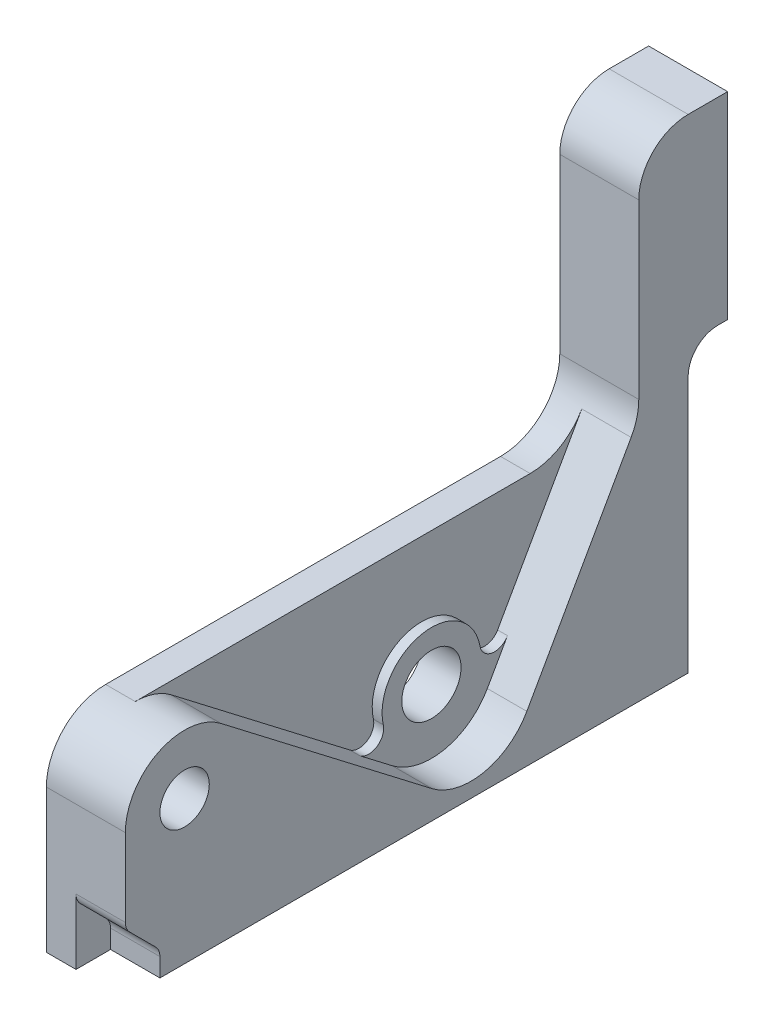
ISO-10303-21;
HEADER;
FILE_DESCRIPTION(('STEP AP214'),'2;1');
FILE_NAME('part.step','',(''),(''),'','','');
FILE_SCHEMA(('AUTOMOTIVE_DESIGN { 1 0 10303 214 1 1 1 1 }'));
ENDSEC;
DATA;
#1=APPLICATION_CONTEXT('core data for automotive mechanical design processes');
#2=APPLICATION_PROTOCOL_DEFINITION('international standard','automotive_design',2000,#1);
#3=PRODUCT_CONTEXT('',#1,'mechanical');
#4=PRODUCT('Part','Part','',(#3));
#5=PRODUCT_RELATED_PRODUCT_CATEGORY('part','',(#4));
#6=PRODUCT_DEFINITION_FORMATION('','',#4);
#7=PRODUCT_DEFINITION_CONTEXT('part definition',#1,'design');
#8=PRODUCT_DEFINITION('design','',#6,#7);
#9=PRODUCT_DEFINITION_SHAPE('','',#8);
#10=(LENGTH_UNIT() NAMED_UNIT(*) SI_UNIT(.MILLI.,.METRE.));
#11=(NAMED_UNIT(*) PLANE_ANGLE_UNIT() SI_UNIT($,.RADIAN.));
#12=(NAMED_UNIT(*) SI_UNIT($,.STERADIAN.) SOLID_ANGLE_UNIT());
#13=UNCERTAINTY_MEASURE_WITH_UNIT(LENGTH_MEASURE(1.E-05),#10,'distance_accuracy_value','');
#14=(GEOMETRIC_REPRESENTATION_CONTEXT(3) GLOBAL_UNCERTAINTY_ASSIGNED_CONTEXT((#13)) GLOBAL_UNIT_ASSIGNED_CONTEXT((#10,
#11,#12)) REPRESENTATION_CONTEXT('',''));
#15=CARTESIAN_POINT('',(0.,0.,0.));
#16=DIRECTION('',(0.,0.,1.));
#17=DIRECTION('',(1.,0.,0.));
#18=AXIS2_PLACEMENT_3D('',#15,#16,#17);
#19=CARTESIAN_POINT('',(3.,26.5,-46.));
#20=DIRECTION('',(1.,0.,0.));
#21=DIRECTION('',(0.,0.,-1.));
#22=AXIS2_PLACEMENT_3D('',#19,#20,#21);
#23=PLANE('',#22);
#24=DIRECTION('',(0.,-0.608841317764241,-0.793292033101999));
#25=VECTOR('',#24,1.);
#26=CARTESIAN_POINT('',(3.,19.259752198612,-9.65304790658545));
#27=LINE('',#26,#25);
#28=CARTESIAN_POINT('',(3.,19.259752198612,-9.65304790658544));
#29=VERTEX_POINT('',#28);
#30=CARTESIAN_POINT('',(3.,5.37230969427247,-27.7477421683185));
#31=VERTEX_POINT('',#30);
#32=EDGE_CURVE('E280',#29,#31,#27,.T.);
#33=ORIENTED_EDGE('',*,*,#32,.T.);
#34=CARTESIAN_POINT('',(3.,6.56224774392547,-28.6610041449649));
#35=DIRECTION('',(-1.,0.,0.));
#36=DIRECTION('',(0.,0.,1.));
#37=AXIS2_PLACEMENT_3D('',#34,#35,#36);
#38=CIRCLE('',#37,1.5);
#39=CARTESIAN_POINT('',(3.,6.89403672609651,-30.1238493422807));
#40=VERTEX_POINT('',#39);
#41=EDGE_CURVE('E228',#40,#31,#38,.T.);
#42=ORIENTED_EDGE('',*,*,#41,.F.);
#43=CARTESIAN_POINT('',(3.,8.,-35.));
#44=DIRECTION('',(1.,0.,0.));
#45=DIRECTION('',(0.,0.,1.));
#46=AXIS2_PLACEMENT_3D('',#43,#44,#45);
#47=CIRCLE('',#46,5.);
#48=CARTESIAN_POINT('',(3.,8.89493751867646,-39.9192567363033));
#49=VERTEX_POINT('',#48);
#50=EDGE_CURVE('E222',#49,#40,#47,.T.);
#51=ORIENTED_EDGE('',*,*,#50,.F.);
#52=CARTESIAN_POINT('',(3.,9.1634187742794,-41.3950337571943));
#53=DIRECTION('',(-1.,0.,0.));
#54=DIRECTION('',(0.,0.,-1.));
#55=AXIS2_PLACEMENT_3D('',#52,#53,#54);
#56=CIRCLE('',#55,1.5);
#57=CARTESIAN_POINT('',(3.,8.42696400027557,-42.7017986043825));
#58=VERTEX_POINT('',#57);
#59=EDGE_CURVE('E251',#58,#49,#56,.T.);
#60=ORIENTED_EDGE('',*,*,#59,.F.);
#61=DIRECTION('',(0.,0.871176564792175,-0.490969849335888));
#62=VECTOR('',#61,1.);
#63=CARTESIAN_POINT('',(3.,4.80869597931673,-40.6626476711491));
#64=LINE('',#63,#62);
#65=CARTESIAN_POINT('',(3.,23.5541809039847,-51.227059388753));
#66=VERTEX_POINT('',#65);
#67=EDGE_CURVE('E283',#58,#66,#64,.T.);
#68=ORIENTED_EDGE('',*,*,#67,.T.);
#69=CARTESIAN_POINT('',(3.,26.5,-46.));
#70=DIRECTION('',(1.,0.,0.));
#71=DIRECTION('',(0.,0.,-1.));
#72=AXIS2_PLACEMENT_3D('',#69,#70,#71);
#73=CIRCLE('',#72,6.);
#74=CARTESIAN_POINT('',(3.,20.5,-46.));
#75=VERTEX_POINT('',#74);
#76=EDGE_CURVE('E301',#66,#75,#73,.F.);
#77=ORIENTED_EDGE('',*,*,#76,.T.);
#78=DIRECTION('',(0.,0.,1.));
#79=VECTOR('',#78,1.);
#80=CARTESIAN_POINT('',(3.,20.5,-6.));
#81=LINE('',#80,#79);
#82=CARTESIAN_POINT('',(3.,20.5,-6.));
#83=VERTEX_POINT('',#82);
#84=EDGE_CURVE('E294',#75,#83,#81,.T.);
#85=ORIENTED_EDGE('',*,*,#84,.T.);
#86=CARTESIAN_POINT('',(3.,14.5,-5.99999999999998));
#87=DIRECTION('',(-1.,0.,0.));
#88=DIRECTION('',(0.,0.,1.));
#89=AXIS2_PLACEMENT_3D('',#86,#87,#88);
#90=CIRCLE('',#89,5.99999999999999);
#91=EDGE_CURVE('E278',#83,#29,#90,.T.);
#92=ORIENTED_EDGE('',*,*,#91,.T.);
#93=EDGE_LOOP('',(#33,#42,#51,#60,#68,#77,#85,#92));
#94=FACE_BOUND('',#93,.T.);
#95=ADVANCED_FACE('F32',(#94),#23,.T.);
#96=CARTESIAN_POINT('',(3.,4.80869597931673,-40.6626476711491));
#97=DIRECTION('',(0.,-0.490969849335888,-0.871176564792175));
#98=DIRECTION('',(0.,0.871176564792175,-0.490969849335888));
#99=AXIS2_PLACEMENT_3D('',#96,#97,#98);
#100=PLANE('',#99);
#101=DIRECTION('',(0.,0.871176564792176,-0.490969849335887));
#102=VECTOR('',#101,1.);
#103=CARTESIAN_POINT('',(4.,4.80869597931672,-40.6626476711491));
#104=LINE('',#103,#102);
#105=CARTESIAN_POINT('',(4.,4.80869597931672,-40.6626476711491));
#106=VERTEX_POINT('',#105);
#107=CARTESIAN_POINT('',(4.,8.42696400027557,-42.7017986043825));
#108=VERTEX_POINT('',#107);
#109=EDGE_CURVE('E241',#106,#108,#104,.T.);
#110=ORIENTED_EDGE('',*,*,#109,.F.);
#111=DIRECTION('',(1.,0.,0.));
#112=VECTOR('',#111,1.);
#113=CARTESIAN_POINT('',(3.,4.80869597931672,-40.6626476711491));
#114=LINE('',#113,#112);
#115=CARTESIAN_POINT('',(8.,4.80869597931672,-40.6626476711491));
#116=VERTEX_POINT('',#115);
#117=EDGE_CURVE('E295',#106,#116,#114,.T.);
#118=ORIENTED_EDGE('',*,*,#117,.T.);
#119=DIRECTION('',(0.,0.871176564792175,-0.490969849335888));
#120=VECTOR('',#119,1.);
#121=CARTESIAN_POINT('',(8.,4.80869597931673,-40.6626476711491));
#122=LINE('',#121,#120);
#123=CARTESIAN_POINT('',(8.,23.5541809039847,-51.227059388753));
#124=VERTEX_POINT('',#123);
#125=EDGE_CURVE('E281',#116,#124,#122,.T.);
#126=ORIENTED_EDGE('',*,*,#125,.T.);
#127=DIRECTION('',(1.,0.,0.));
#128=VECTOR('',#127,1.);
#129=CARTESIAN_POINT('',(3.,23.5541809039847,-51.227059388753));
#130=LINE('',#129,#128);
#131=EDGE_CURVE('E291',#66,#124,#130,.T.);
#132=ORIENTED_EDGE('',*,*,#131,.F.);
#133=ORIENTED_EDGE('',*,*,#67,.F.);
#134=DIRECTION('',(-1.,0.,0.));
#135=VECTOR('',#134,1.);
#136=CARTESIAN_POINT('',(4.,8.42696400027557,-42.7017986043825));
#137=LINE('',#136,#135);
#138=EDGE_CURVE('E233',#108,#58,#137,.T.);
#139=ORIENTED_EDGE('',*,*,#138,.F.);
#140=EDGE_LOOP('',(#110,#118,#126,#132,#133,#139));
#141=FACE_BOUND('',#140,.T.);
#142=ADVANCED_FACE('F511',(#141),#100,.F.);
#143=CARTESIAN_POINT('',(3.,8.,-35.));
#144=DIRECTION('',(1.,0.,0.));
#145=DIRECTION('',(0.,0.,-1.));
#146=AXIS2_PLACEMENT_3D('',#143,#144,#145);
#147=CYLINDRICAL_SURFACE('',#146,6.5);
#148=CARTESIAN_POINT('',(4.,8.00000000000005,-35.));
#149=DIRECTION('',(1.,0.,0.));
#150=DIRECTION('',(0.,0.,-1.));
#151=AXIS2_PLACEMENT_3D('',#148,#149,#150);
#152=CIRCLE('',#151,6.50000000000003);
#153=CARTESIAN_POINT('',(4.,2.84360178483701,-31.0425314345324));
#154=VERTEX_POINT('',#153);
#155=EDGE_CURVE('E239',#154,#106,#152,.T.);
#156=ORIENTED_EDGE('',*,*,#155,.F.);
#157=DIRECTION('',(1.,0.,0.));
#158=VECTOR('',#157,1.);
#159=CARTESIAN_POINT('',(3.,2.84360178483701,-31.0425314345324));
#160=LINE('',#159,#158);
#161=CARTESIAN_POINT('',(8.,2.84360178483701,-31.0425314345324));
#162=VERTEX_POINT('',#161);
#163=EDGE_CURVE('E238',#154,#162,#160,.T.);
#164=ORIENTED_EDGE('',*,*,#163,.T.);
#165=CARTESIAN_POINT('',(8.,8.,-35.));
#166=DIRECTION('',(1.,0.,0.));
#167=DIRECTION('',(0.,0.,-1.));
#168=AXIS2_PLACEMENT_3D('',#165,#166,#167);
#169=CIRCLE('',#168,6.5);
#170=EDGE_CURVE('E287',#162,#116,#169,.T.);
#171=ORIENTED_EDGE('',*,*,#170,.T.);
#172=ORIENTED_EDGE('',*,*,#117,.F.);
#173=EDGE_LOOP('',(#156,#164,#171,#172));
#174=FACE_BOUND('',#173,.T.);
#175=ADVANCED_FACE('F516',(#174),#147,.F.);
#176=CARTESIAN_POINT('',(3.,19.259752198612,-9.65304790658545));
#177=DIRECTION('',(0.,-0.793292033101999,0.608841317764241));
#178=DIRECTION('',(0.,-0.608841317764241,-0.793292033101999));
#179=AXIS2_PLACEMENT_3D('',#176,#177,#178);
#180=PLANE('',#179);
#181=DIRECTION('',(0.,-0.60884131776424,-0.793292033101999));
#182=VECTOR('',#181,1.);
#183=CARTESIAN_POINT('',(4.,5.37230969427247,-27.7477421683185));
#184=LINE('',#183,#182);
#185=CARTESIAN_POINT('',(4.,5.37230969427247,-27.7477421683185));
#186=VERTEX_POINT('',#185);
#187=EDGE_CURVE('E215',#186,#154,#184,.T.);
#188=ORIENTED_EDGE('',*,*,#187,.F.);
#189=DIRECTION('',(-1.,0.,0.));
#190=VECTOR('',#189,1.);
#191=CARTESIAN_POINT('',(4.,5.37230969427247,-27.7477421683185));
#192=LINE('',#191,#190);
#193=EDGE_CURVE('E225',#186,#31,#192,.T.);
#194=ORIENTED_EDGE('',*,*,#193,.T.);
#195=ORIENTED_EDGE('',*,*,#32,.F.);
#196=DIRECTION('',(1.,0.,0.));
#197=VECTOR('',#196,1.);
#198=CARTESIAN_POINT('',(3.,19.259752198612,-9.65304790658544));
#199=LINE('',#198,#197);
#200=CARTESIAN_POINT('',(8.,19.259752198612,-9.65304790658544));
#201=VERTEX_POINT('',#200);
#202=EDGE_CURVE('E285',#29,#201,#199,.T.);
#203=ORIENTED_EDGE('',*,*,#202,.T.);
#204=DIRECTION('',(0.,-0.608841317764241,-0.793292033101999));
#205=VECTOR('',#204,1.);
#206=CARTESIAN_POINT('',(8.,19.259752198612,-9.65304790658545));
#207=LINE('',#206,#205);
#208=EDGE_CURVE('E277',#201,#162,#207,.T.);
#209=ORIENTED_EDGE('',*,*,#208,.T.);
#210=ORIENTED_EDGE('',*,*,#163,.F.);
#211=EDGE_LOOP('',(#188,#194,#195,#203,#209,#210));
#212=FACE_BOUND('',#211,.T.);
#213=ADVANCED_FACE('F236',(#212),#180,.F.);
#214=CARTESIAN_POINT('',(8.,8.,-35.));
#215=DIRECTION('',(-1.,0.,0.));
#216=DIRECTION('',(0.,0.,1.));
#217=AXIS2_PLACEMENT_3D('',#214,#215,#216);
#218=CYLINDRICAL_SURFACE('',#217,3.);
#219=CARTESIAN_POINT('',(0.,8.,-35.));
#220=DIRECTION('',(1.,0.,0.));
#221=DIRECTION('',(0.,0.,-1.));
#222=AXIS2_PLACEMENT_3D('',#219,#220,#221);
#223=CIRCLE('',#222,3.);
#224=CARTESIAN_POINT('',(0.,8.,-38.));
#225=VERTEX_POINT('',#224);
#226=EDGE_CURVE('E373',#225,#225,#223,.T.);
#227=ORIENTED_EDGE('',*,*,#226,.F.);
#228=EDGE_LOOP('',(#227));
#229=FACE_BOUND('',#228,.T.);
#230=CARTESIAN_POINT('',(4.,8.,-35.));
#231=DIRECTION('',(1.,0.,0.));
#232=DIRECTION('',(0.,0.,-1.));
#233=AXIS2_PLACEMENT_3D('',#230,#231,#232);
#234=CIRCLE('',#233,3.);
#235=CARTESIAN_POINT('',(4.,8.,-38.));
#236=VERTEX_POINT('',#235);
#237=EDGE_CURVE('E252',#236,#236,#234,.T.);
#238=ORIENTED_EDGE('',*,*,#237,.T.);
#239=EDGE_LOOP('',(#238));
#240=FACE_BOUND('',#239,.T.);
#241=ADVANCED_FACE('F556',(#229,#240),#218,.F.);
#242=CARTESIAN_POINT('',(0.,26.5,-46.));
#243=DIRECTION('',(1.,0.,0.));
#244=DIRECTION('',(0.,0.,-1.));
#245=AXIS2_PLACEMENT_3D('',#242,#243,#244);
#246=CYLINDRICAL_SURFACE('',#245,6.);
#247=ORIENTED_EDGE('',*,*,#76,.F.);
#248=ORIENTED_EDGE('',*,*,#131,.T.);
#249=CARTESIAN_POINT('',(8.,26.5,-46.));
#250=DIRECTION('',(1.,0.,0.));
#251=DIRECTION('',(0.,0.,1.));
#252=AXIS2_PLACEMENT_3D('',#249,#250,#251);
#253=CIRCLE('',#252,6.);
#254=CARTESIAN_POINT('',(8.,26.5,-52.));
#255=VERTEX_POINT('',#254);
#256=EDGE_CURVE('E319',#124,#255,#253,.T.);
#257=ORIENTED_EDGE('',*,*,#256,.T.);
#258=DIRECTION('',(1.,0.,0.));
#259=VECTOR('',#258,1.);
#260=CARTESIAN_POINT('',(0.,26.5,-52.));
#261=LINE('',#260,#259);
#262=CARTESIAN_POINT('',(0.,26.5,-52.));
#263=VERTEX_POINT('',#262);
#264=EDGE_CURVE('E324',#263,#255,#261,.T.);
#265=ORIENTED_EDGE('',*,*,#264,.F.);
#266=CARTESIAN_POINT('',(0.,26.5,-46.));
#267=DIRECTION('',(1.,0.,0.));
#268=DIRECTION('',(0.,0.,1.));
#269=AXIS2_PLACEMENT_3D('',#266,#267,#268);
#270=CIRCLE('',#269,6.);
#271=CARTESIAN_POINT('',(0.,20.5,-46.));
#272=VERTEX_POINT('',#271);
#273=EDGE_CURVE('E311',#272,#263,#270,.T.);
#274=ORIENTED_EDGE('',*,*,#273,.F.);
#275=DIRECTION('',(1.,0.,0.));
#276=VECTOR('',#275,1.);
#277=CARTESIAN_POINT('',(0.,20.5,-46.));
#278=LINE('',#277,#276);
#279=EDGE_CURVE('E327',#272,#75,#278,.T.);
#280=ORIENTED_EDGE('',*,*,#279,.T.);
#281=EDGE_LOOP('',(#247,#248,#257,#265,#274,#280));
#282=FACE_BOUND('',#281,.T.);
#283=ADVANCED_FACE('F503',(#282),#246,.F.);
#284=CARTESIAN_POINT('',(0.,20.5,-6.));
#285=DIRECTION('',(0.,-1.,0.));
#286=DIRECTION('',(0.,0.,-1.));
#287=AXIS2_PLACEMENT_3D('',#284,#285,#286);
#288=PLANE('',#287);
#289=ORIENTED_EDGE('',*,*,#84,.F.);
#290=ORIENTED_EDGE('',*,*,#279,.F.);
#291=DIRECTION('',(0.,0.,-1.));
#292=VECTOR('',#291,1.);
#293=CARTESIAN_POINT('',(0.,20.5,-6.));
#294=LINE('',#293,#292);
#295=CARTESIAN_POINT('',(0.,20.5,-6.));
#296=VERTEX_POINT('',#295);
#297=EDGE_CURVE('E307',#296,#272,#294,.T.);
#298=ORIENTED_EDGE('',*,*,#297,.F.);
#299=DIRECTION('',(1.,0.,0.));
#300=VECTOR('',#299,1.);
#301=CARTESIAN_POINT('',(0.,20.5,-6.));
#302=LINE('',#301,#300);
#303=EDGE_CURVE('E330',#296,#83,#302,.T.);
#304=ORIENTED_EDGE('',*,*,#303,.T.);
#305=EDGE_LOOP('',(#289,#290,#298,#304));
#306=FACE_BOUND('',#305,.T.);
#307=ADVANCED_FACE('F524',(#306),#288,.F.);
#308=CARTESIAN_POINT('',(8.,49.,0.));
#309=DIRECTION('',(-1.,0.,0.));
#310=DIRECTION('',(0.,0.,1.));
#311=AXIS2_PLACEMENT_3D('',#308,#309,#310);
#312=PLANE('',#311);
#313=CARTESIAN_POINT('',(8.,14.5,-6.));
#314=DIRECTION('',(1.,0.,0.));
#315=DIRECTION('',(0.,0.,-1.));
#316=AXIS2_PLACEMENT_3D('',#313,#314,#315);
#317=CIRCLE('',#316,2.5);
#318=CARTESIAN_POINT('',(8.,14.5,-8.5));
#319=VERTEX_POINT('',#318);
#320=EDGE_CURVE('E377',#319,#319,#317,.T.);
#321=ORIENTED_EDGE('',*,*,#320,.F.);
#322=EDGE_LOOP('',(#321));
#323=FACE_BOUND('',#322,.T.);
#324=DIRECTION('',(0.,-1.,0.));
#325=VECTOR('',#324,1.);
#326=CARTESIAN_POINT('',(8.,0.,0.));
#327=LINE('',#326,#325);
#328=CARTESIAN_POINT('',(8.,14.5,0.));
#329=VERTEX_POINT('',#328);
#330=CARTESIAN_POINT('',(8.,6.62132034355964,0.));
#331=VERTEX_POINT('',#330);
#332=EDGE_CURVE('E383',#329,#331,#327,.T.);
#333=ORIENTED_EDGE('',*,*,#332,.T.);
#334=CARTESIAN_POINT('',(8.,6.62132034355964,-1.5));
#335=DIRECTION('',(-1.,0.,0.));
#336=DIRECTION('',(0.,0.,1.));
#337=AXIS2_PLACEMENT_3D('',#334,#335,#336);
#338=CIRCLE('',#337,1.5);
#339=CARTESIAN_POINT('',(8.,5.56066017177982,-0.439339828220173));
#340=VERTEX_POINT('',#339);
#341=EDGE_CURVE('E54',#331,#340,#338,.F.);
#342=ORIENTED_EDGE('',*,*,#341,.T.);
#343=DIRECTION('',(0.,0.707106781186551,0.707106781186544));
#344=VECTOR('',#343,1.);
#345=CARTESIAN_POINT('',(8.,6.,0.));
#346=LINE('',#345,#344);
#347=CARTESIAN_POINT('',(8.,2.93933982822014,-3.06066017177983));
#348=VERTEX_POINT('',#347);
#349=EDGE_CURVE('E262',#348,#340,#346,.T.);
#350=ORIENTED_EDGE('',*,*,#349,.F.);
#351=CARTESIAN_POINT('',(8.,1.87867965644033,-2.));
#352=DIRECTION('',(-1.,0.,0.));
#353=DIRECTION('',(0.,0.,1.));
#354=AXIS2_PLACEMENT_3D('',#351,#352,#353);
#355=CIRCLE('',#354,1.5);
#356=CARTESIAN_POINT('',(8.,1.87867965644033,-3.5));
#357=VERTEX_POINT('',#356);
#358=EDGE_CURVE('E40',#348,#357,#355,.T.);
#359=ORIENTED_EDGE('',*,*,#358,.T.);
#360=DIRECTION('',(0.,1.,0.));
#361=VECTOR('',#360,1.);
#362=CARTESIAN_POINT('',(8.,2.49999999999997,-3.5));
#363=LINE('',#362,#361);
#364=CARTESIAN_POINT('',(8.,0.,-3.5));
#365=VERTEX_POINT('',#364);
#366=EDGE_CURVE('E232',#365,#357,#363,.T.);
#367=ORIENTED_EDGE('',*,*,#366,.F.);
#368=DIRECTION('',(0.,0.,-1.));
#369=VECTOR('',#368,1.);
#370=CARTESIAN_POINT('',(8.,0.,0.));
#371=LINE('',#370,#369);
#372=CARTESIAN_POINT('',(8.,0.,-57.));
#373=VERTEX_POINT('',#372);
#374=EDGE_CURVE('E386',#365,#373,#371,.T.);
#375=ORIENTED_EDGE('',*,*,#374,.T.);
#376=DIRECTION('',(0.,-1.,0.));
#377=VECTOR('',#376,1.);
#378=CARTESIAN_POINT('',(8.,0.,-57.));
#379=LINE('',#378,#377);
#380=CARTESIAN_POINT('',(8.,26.,-57.));
#381=VERTEX_POINT('',#380);
#382=EDGE_CURVE('E362',#381,#373,#379,.T.);
#383=ORIENTED_EDGE('',*,*,#382,.F.);
#384=CARTESIAN_POINT('',(8.,26.,-60.));
#385=DIRECTION('',(-1.,0.,0.));
#386=DIRECTION('',(0.,0.,1.));
#387=AXIS2_PLACEMENT_3D('',#384,#385,#386);
#388=CIRCLE('',#387,3.);
#389=CARTESIAN_POINT('',(8.,29.,-60.));
#390=VERTEX_POINT('',#389);
#391=EDGE_CURVE('E413',#381,#390,#388,.T.);
#392=ORIENTED_EDGE('',*,*,#391,.T.);
#393=DIRECTION('',(0.,0.,1.));
#394=VECTOR('',#393,1.);
#395=CARTESIAN_POINT('',(8.,29.,-61.));
#396=LINE('',#395,#394);
#397=CARTESIAN_POINT('',(8.,29.,-61.));
#398=VERTEX_POINT('',#397);
#399=EDGE_CURVE('E359',#398,#390,#396,.T.);
#400=ORIENTED_EDGE('',*,*,#399,.F.);
#401=DIRECTION('',(0.,1.,0.));
#402=VECTOR('',#401,1.);
#403=CARTESIAN_POINT('',(8.,0.,-61.));
#404=LINE('',#403,#402);
#405=CARTESIAN_POINT('',(8.,49.,-61.));
#406=VERTEX_POINT('',#405);
#407=EDGE_CURVE('E389',#398,#406,#404,.T.);
#408=ORIENTED_EDGE('',*,*,#407,.T.);
#409=DIRECTION('',(0.,0.,1.));
#410=VECTOR('',#409,1.);
#411=CARTESIAN_POINT('',(8.,49.,0.));
#412=LINE('',#411,#410);
#413=CARTESIAN_POINT('',(8.,49.,-57.));
#414=VERTEX_POINT('',#413);
#415=EDGE_CURVE('E391',#406,#414,#412,.T.);
#416=ORIENTED_EDGE('',*,*,#415,.T.);
#417=CARTESIAN_POINT('',(8.,44.,-57.));
#418=DIRECTION('',(-1.,0.,0.));
#419=DIRECTION('',(0.,0.,1.));
#420=AXIS2_PLACEMENT_3D('',#417,#418,#419);
#421=CIRCLE('',#420,5.);
#422=CARTESIAN_POINT('',(8.,44.,-52.));
#423=VERTEX_POINT('',#422);
#424=EDGE_CURVE('E420',#414,#423,#421,.F.);
#425=ORIENTED_EDGE('',*,*,#424,.T.);
#426=DIRECTION('',(0.,1.,0.));
#427=VECTOR('',#426,1.);
#428=CARTESIAN_POINT('',(8.,49.,-52.));
#429=LINE('',#428,#427);
#430=EDGE_CURVE('E308',#255,#423,#429,.T.);
#431=ORIENTED_EDGE('',*,*,#430,.F.);
#432=ORIENTED_EDGE('',*,*,#256,.F.);
#433=ORIENTED_EDGE('',*,*,#125,.F.);
#434=ORIENTED_EDGE('',*,*,#170,.F.);
#435=ORIENTED_EDGE('',*,*,#208,.F.);
#436=CARTESIAN_POINT('',(8.,14.5,-6.));
#437=DIRECTION('',(-1.,0.,0.));
#438=DIRECTION('',(0.,0.,1.));
#439=AXIS2_PLACEMENT_3D('',#436,#437,#438);
#440=CIRCLE('',#439,6.);
#441=EDGE_CURVE('E303',#329,#201,#440,.T.);
#442=ORIENTED_EDGE('',*,*,#441,.F.);
#443=EDGE_LOOP('',(#333,#342,#350,#359,#367,#375,#383,#392,#400,#408,#416,#425,#431,#432,#433,
#434,#435,#442));
#444=FACE_BOUND('',#443,.T.);
#445=ADVANCED_FACE('F440',(#323,#444),#312,.F.);
#446=CARTESIAN_POINT('',(0.,49.,0.));
#447=DIRECTION('',(-1.,0.,0.));
#448=DIRECTION('',(0.,0.,1.));
#449=AXIS2_PLACEMENT_3D('',#446,#447,#448);
#450=PLANE('',#449);
#451=DIRECTION('',(0.,1.,0.));
#452=VECTOR('',#451,1.);
#453=CARTESIAN_POINT('',(0.,49.,-52.));
#454=LINE('',#453,#452);
#455=CARTESIAN_POINT('',(0.,44.,-52.));
#456=VERTEX_POINT('',#455);
#457=EDGE_CURVE('E314',#263,#456,#454,.T.);
#458=ORIENTED_EDGE('',*,*,#457,.T.);
#459=CARTESIAN_POINT('',(0.,44.,-57.));
#460=DIRECTION('',(-1.,0.,0.));
#461=DIRECTION('',(0.,0.,1.));
#462=AXIS2_PLACEMENT_3D('',#459,#460,#461);
#463=CIRCLE('',#462,5.);
#464=CARTESIAN_POINT('',(0.,49.,-57.));
#465=VERTEX_POINT('',#464);
#466=EDGE_CURVE('E424',#456,#465,#463,.T.);
#467=ORIENTED_EDGE('',*,*,#466,.T.);
#468=DIRECTION('',(0.,0.,1.));
#469=VECTOR('',#468,1.);
#470=CARTESIAN_POINT('',(0.,49.,0.));
#471=LINE('',#470,#469);
#472=CARTESIAN_POINT('',(0.,49.,-61.));
#473=VERTEX_POINT('',#472);
#474=EDGE_CURVE('E387',#473,#465,#471,.T.);
#475=ORIENTED_EDGE('',*,*,#474,.F.);
#476=DIRECTION('',(0.,1.,0.));
#477=VECTOR('',#476,1.);
#478=CARTESIAN_POINT('',(0.,0.,-61.));
#479=LINE('',#478,#477);
#480=CARTESIAN_POINT('',(0.,29.,-61.));
#481=VERTEX_POINT('',#480);
#482=EDGE_CURVE('E400',#481,#473,#479,.T.);
#483=ORIENTED_EDGE('',*,*,#482,.F.);
#484=DIRECTION('',(0.,0.,1.));
#485=VECTOR('',#484,1.);
#486=CARTESIAN_POINT('',(0.,29.,-61.));
#487=LINE('',#486,#485);
#488=CARTESIAN_POINT('',(0.,29.,-60.));
#489=VERTEX_POINT('',#488);
#490=EDGE_CURVE('E369',#481,#489,#487,.T.);
#491=ORIENTED_EDGE('',*,*,#490,.T.);
#492=CARTESIAN_POINT('',(0.,26.,-60.));
#493=DIRECTION('',(-1.,0.,0.));
#494=DIRECTION('',(0.,0.,1.));
#495=AXIS2_PLACEMENT_3D('',#492,#493,#494);
#496=CIRCLE('',#495,3.);
#497=CARTESIAN_POINT('',(0.,26.,-57.));
#498=VERTEX_POINT('',#497);
#499=EDGE_CURVE('E415',#489,#498,#496,.F.);
#500=ORIENTED_EDGE('',*,*,#499,.T.);
#501=DIRECTION('',(0.,-1.,0.));
#502=VECTOR('',#501,1.);
#503=CARTESIAN_POINT('',(0.,0.,-57.));
#504=LINE('',#503,#502);
#505=CARTESIAN_POINT('',(0.,0.,-57.));
#506=VERTEX_POINT('',#505);
#507=EDGE_CURVE('E357',#498,#506,#504,.T.);
#508=ORIENTED_EDGE('',*,*,#507,.T.);
#509=DIRECTION('',(0.,0.,-1.));
#510=VECTOR('',#509,1.);
#511=CARTESIAN_POINT('',(0.,0.,0.));
#512=LINE('',#511,#510);
#513=CARTESIAN_POINT('',(0.,0.,0.));
#514=VERTEX_POINT('',#513);
#515=EDGE_CURVE('E397',#514,#506,#512,.T.);
#516=ORIENTED_EDGE('',*,*,#515,.F.);
#517=DIRECTION('',(0.,-1.,0.));
#518=VECTOR('',#517,1.);
#519=CARTESIAN_POINT('',(0.,0.,0.));
#520=LINE('',#519,#518);
#521=CARTESIAN_POINT('',(0.,14.5,0.));
#522=VERTEX_POINT('',#521);
#523=EDGE_CURVE('E380',#522,#514,#520,.T.);
#524=ORIENTED_EDGE('',*,*,#523,.F.);
#525=CARTESIAN_POINT('',(0.,14.5,-6.));
#526=DIRECTION('',(-1.,0.,0.));
#527=DIRECTION('',(0.,0.,1.));
#528=AXIS2_PLACEMENT_3D('',#525,#526,#527);
#529=CIRCLE('',#528,6.);
#530=EDGE_CURVE('E304',#522,#296,#529,.T.);
#531=ORIENTED_EDGE('',*,*,#530,.T.);
#532=ORIENTED_EDGE('',*,*,#297,.T.);
#533=ORIENTED_EDGE('',*,*,#273,.T.);
#534=EDGE_LOOP('',(#458,#467,#475,#483,#491,#500,#508,#516,#524,#531,#532,#533));
#535=FACE_BOUND('',#534,.T.);
#536=CARTESIAN_POINT('',(0.,14.5,-6.));
#537=DIRECTION('',(1.,0.,0.));
#538=DIRECTION('',(0.,0.,-1.));
#539=AXIS2_PLACEMENT_3D('',#536,#537,#538);
#540=CIRCLE('',#539,2.5);
#541=CARTESIAN_POINT('',(0.,14.5,-8.5));
#542=VERTEX_POINT('',#541);
#543=EDGE_CURVE('E376',#542,#542,#540,.T.);
#544=ORIENTED_EDGE('',*,*,#543,.T.);
#545=EDGE_LOOP('',(#544));
#546=FACE_BOUND('',#545,.T.);
#547=ORIENTED_EDGE('',*,*,#226,.T.);
#548=EDGE_LOOP('',(#547));
#549=FACE_BOUND('',#548,.T.);
#550=ADVANCED_FACE('F465',(#535,#546,#549),#450,.T.);
#551=CARTESIAN_POINT('',(8.,0.,0.));
#552=DIRECTION('',(0.,0.,-1.));
#553=DIRECTION('',(-1.,0.,0.));
#554=AXIS2_PLACEMENT_3D('',#551,#552,#553);
#555=PLANE('',#554);
#556=DIRECTION('',(0.,-1.,0.));
#557=VECTOR('',#556,1.);
#558=CARTESIAN_POINT('',(3.,0.,0.));
#559=LINE('',#558,#557);
#560=CARTESIAN_POINT('',(3.,6.62132034355964,0.));
#561=VERTEX_POINT('',#560);
#562=CARTESIAN_POINT('',(3.,0.,0.));
#563=VERTEX_POINT('',#562);
#564=EDGE_CURVE('E47',#561,#563,#559,.T.);
#565=ORIENTED_EDGE('',*,*,#564,.F.);
#566=DIRECTION('',(1.,0.,0.));
#567=VECTOR('',#566,1.);
#568=CARTESIAN_POINT('',(8.,6.62132034355964,0.));
#569=LINE('',#568,#567);
#570=EDGE_CURVE('E435',#561,#331,#569,.T.);
#571=ORIENTED_EDGE('',*,*,#570,.T.);
#572=ORIENTED_EDGE('',*,*,#332,.F.);
#573=DIRECTION('',(1.,0.,0.));
#574=VECTOR('',#573,1.);
#575=CARTESIAN_POINT('',(0.,14.5,0.));
#576=LINE('',#575,#574);
#577=EDGE_CURVE('E317',#522,#329,#576,.T.);
#578=ORIENTED_EDGE('',*,*,#577,.F.);
#579=ORIENTED_EDGE('',*,*,#523,.T.);
#580=DIRECTION('',(-1.,0.,0.));
#581=VECTOR('',#580,1.);
#582=CARTESIAN_POINT('',(8.,0.,0.));
#583=LINE('',#582,#581);
#584=EDGE_CURVE('E406',#563,#514,#583,.T.);
#585=ORIENTED_EDGE('',*,*,#584,.F.);
#586=EDGE_LOOP('',(#565,#571,#572,#578,#579,#585));
#587=FACE_BOUND('',#586,.T.);
#588=ADVANCED_FACE('F459',(#587),#555,.F.);
#589=CARTESIAN_POINT('',(8.,0.,0.));
#590=DIRECTION('',(0.,1.,0.));
#591=DIRECTION('',(0.,0.,1.));
#592=AXIS2_PLACEMENT_3D('',#589,#590,#591);
#593=PLANE('',#592);
#594=CARTESIAN_POINT('',(4.,0.,-48.));
#595=DIRECTION('',(0.,-1.,0.));
#596=DIRECTION('',(0.,0.,-1.));
#597=AXIS2_PLACEMENT_3D('',#594,#595,#596);
#598=CIRCLE('',#597,1.24999999999999);
#599=CARTESIAN_POINT('',(4.,0.,-49.25));
#600=VERTEX_POINT('',#599);
#601=EDGE_CURVE('E345',#600,#600,#598,.T.);
#602=ORIENTED_EDGE('',*,*,#601,.F.);
#603=EDGE_LOOP('',(#602));
#604=FACE_BOUND('',#603,.T.);
#605=CARTESIAN_POINT('',(4.,0.,-12.));
#606=DIRECTION('',(0.,-1.,0.));
#607=DIRECTION('',(0.,0.,-1.));
#608=AXIS2_PLACEMENT_3D('',#605,#606,#607);
#609=CIRCLE('',#608,1.24999999999999);
#610=CARTESIAN_POINT('',(4.,0.,-13.25));
#611=VERTEX_POINT('',#610);
#612=EDGE_CURVE('E351',#611,#611,#609,.T.);
#613=ORIENTED_EDGE('',*,*,#612,.F.);
#614=EDGE_LOOP('',(#613));
#615=FACE_BOUND('',#614,.T.);
#616=ORIENTED_EDGE('',*,*,#374,.F.);
#617=DIRECTION('',(1.,0.,0.));
#618=VECTOR('',#617,1.);
#619=CARTESIAN_POINT('',(3.,0.,-3.5));
#620=LINE('',#619,#618);
#621=CARTESIAN_POINT('',(3.,0.,-3.5));
#622=VERTEX_POINT('',#621);
#623=EDGE_CURVE('E271',#622,#365,#620,.T.);
#624=ORIENTED_EDGE('',*,*,#623,.F.);
#625=DIRECTION('',(0.,0.,-1.));
#626=VECTOR('',#625,1.);
#627=CARTESIAN_POINT('',(3.,0.,-3.5));
#628=LINE('',#627,#626);
#629=EDGE_CURVE('E261',#563,#622,#628,.T.);
#630=ORIENTED_EDGE('',*,*,#629,.F.);
#631=ORIENTED_EDGE('',*,*,#584,.T.);
#632=ORIENTED_EDGE('',*,*,#515,.T.);
#633=DIRECTION('',(1.,0.,0.));
#634=VECTOR('',#633,1.);
#635=CARTESIAN_POINT('',(-0.000999999999999265,0.,-57.));
#636=LINE('',#635,#634);
#637=EDGE_CURVE('E366',#506,#373,#636,.T.);
#638=ORIENTED_EDGE('',*,*,#637,.T.);
#639=EDGE_LOOP('',(#616,#624,#630,#631,#632,#638));
#640=FACE_BOUND('',#639,.T.);
#641=ADVANCED_FACE('F458',(#604,#615,#640),#593,.F.);
#642=CARTESIAN_POINT('',(8.,0.,-61.));
#643=DIRECTION('',(0.,0.,1.));
#644=DIRECTION('',(1.,0.,0.));
#645=AXIS2_PLACEMENT_3D('',#642,#643,#644);
#646=PLANE('',#645);
#647=CARTESIAN_POINT('',(4.,44.,-61.));
#648=DIRECTION('',(0.,0.,-1.));
#649=DIRECTION('',(-1.,0.,0.));
#650=AXIS2_PLACEMENT_3D('',#647,#648,#649);
#651=CIRCLE('',#650,1.25);
#652=CARTESIAN_POINT('',(2.75,44.,-61.));
#653=VERTEX_POINT('',#652);
#654=EDGE_CURVE('E326',#653,#653,#651,.T.);
#655=ORIENTED_EDGE('',*,*,#654,.F.);
#656=EDGE_LOOP('',(#655));
#657=FACE_BOUND('',#656,.T.);
#658=CARTESIAN_POINT('',(4.,34.,-61.));
#659=DIRECTION('',(0.,0.,-1.));
#660=DIRECTION('',(-1.,0.,0.));
#661=AXIS2_PLACEMENT_3D('',#658,#659,#660);
#662=CIRCLE('',#661,1.25);
#663=CARTESIAN_POINT('',(2.75,34.,-61.));
#664=VERTEX_POINT('',#663);
#665=EDGE_CURVE('E339',#664,#664,#662,.T.);
#666=ORIENTED_EDGE('',*,*,#665,.F.);
#667=EDGE_LOOP('',(#666));
#668=FACE_BOUND('',#667,.T.);
#669=ORIENTED_EDGE('',*,*,#407,.F.);
#670=DIRECTION('',(1.,0.,0.));
#671=VECTOR('',#670,1.);
#672=CARTESIAN_POINT('',(-0.000999999999999265,29.,-61.));
#673=LINE('',#672,#671);
#674=EDGE_CURVE('E365',#481,#398,#673,.T.);
#675=ORIENTED_EDGE('',*,*,#674,.F.);
#676=ORIENTED_EDGE('',*,*,#482,.T.);
#677=DIRECTION('',(-1.,0.,0.));
#678=VECTOR('',#677,1.);
#679=CARTESIAN_POINT('',(8.,49.,-61.));
#680=LINE('',#679,#678);
#681=EDGE_CURVE('E394',#406,#473,#680,.T.);
#682=ORIENTED_EDGE('',*,*,#681,.F.);
#683=EDGE_LOOP('',(#669,#675,#676,#682));
#684=FACE_BOUND('',#683,.T.);
#685=ADVANCED_FACE('F485',(#657,#668,#684),#646,.F.);
#686=CARTESIAN_POINT('',(8.,49.,0.));
#687=DIRECTION('',(0.,-1.,0.));
#688=DIRECTION('',(0.,0.,-1.));
#689=AXIS2_PLACEMENT_3D('',#686,#687,#688);
#690=PLANE('',#689);
#691=ORIENTED_EDGE('',*,*,#474,.T.);
#692=DIRECTION('',(1.,0.,0.));
#693=VECTOR('',#692,1.);
#694=CARTESIAN_POINT('',(8.,49.,-57.));
#695=LINE('',#694,#693);
#696=EDGE_CURVE('E417',#465,#414,#695,.T.);
#697=ORIENTED_EDGE('',*,*,#696,.T.);
#698=ORIENTED_EDGE('',*,*,#415,.F.);
#699=ORIENTED_EDGE('',*,*,#681,.T.);
#700=EDGE_LOOP('',(#691,#697,#698,#699));
#701=FACE_BOUND('',#700,.T.);
#702=ADVANCED_FACE('F490',(#701),#690,.F.);
#703=CARTESIAN_POINT('',(8.,14.5,-6.));
#704=DIRECTION('',(-1.,0.,0.));
#705=DIRECTION('',(0.,0.,1.));
#706=AXIS2_PLACEMENT_3D('',#703,#704,#705);
#707=CYLINDRICAL_SURFACE('',#706,2.5);
#708=ORIENTED_EDGE('',*,*,#320,.T.);
#709=EDGE_LOOP('',(#708));
#710=FACE_BOUND('',#709,.T.);
#711=ORIENTED_EDGE('',*,*,#543,.F.);
#712=EDGE_LOOP('',(#711));
#713=FACE_BOUND('',#712,.T.);
#714=ADVANCED_FACE('F599',(#710,#713),#707,.F.);
#715=CARTESIAN_POINT('',(-0.000999999999999265,0.,-57.));
#716=DIRECTION('',(0.,0.,1.));
#717=DIRECTION('',(1.,0.,0.));
#718=AXIS2_PLACEMENT_3D('',#715,#716,#717);
#719=PLANE('',#718);
#720=ORIENTED_EDGE('',*,*,#507,.F.);
#721=DIRECTION('',(1.,0.,0.));
#722=VECTOR('',#721,1.);
#723=CARTESIAN_POINT('',(8.,26.,-57.));
#724=LINE('',#723,#722);
#725=EDGE_CURVE('E408',#498,#381,#724,.T.);
#726=ORIENTED_EDGE('',*,*,#725,.T.);
#727=ORIENTED_EDGE('',*,*,#382,.T.);
#728=ORIENTED_EDGE('',*,*,#637,.F.);
#729=EDGE_LOOP('',(#720,#726,#727,#728));
#730=FACE_BOUND('',#729,.T.);
#731=ADVANCED_FACE('F470',(#730),#719,.F.);
#732=CARTESIAN_POINT('',(-0.000999999999999265,29.,-61.));
#733=DIRECTION('',(0.,1.,0.));
#734=DIRECTION('',(0.,0.,1.));
#735=AXIS2_PLACEMENT_3D('',#732,#733,#734);
#736=PLANE('',#735);
#737=ORIENTED_EDGE('',*,*,#399,.T.);
#738=DIRECTION('',(1.,0.,0.));
#739=VECTOR('',#738,1.);
#740=CARTESIAN_POINT('',(0.,29.,-60.));
#741=LINE('',#740,#739);
#742=EDGE_CURVE('E411',#390,#489,#741,.F.);
#743=ORIENTED_EDGE('',*,*,#742,.T.);
#744=ORIENTED_EDGE('',*,*,#490,.F.);
#745=ORIENTED_EDGE('',*,*,#674,.T.);
#746=EDGE_LOOP('',(#737,#743,#744,#745));
#747=FACE_BOUND('',#746,.T.);
#748=ADVANCED_FACE('F478',(#747),#736,.F.);
#749=CARTESIAN_POINT('',(-0.000999999999999265,26.,-60.));
#750=DIRECTION('',(-1.,0.,0.));
#751=DIRECTION('',(0.,0.,1.));
#752=AXIS2_PLACEMENT_3D('',#749,#750,#751);
#753=CYLINDRICAL_SURFACE('',#752,3.);
#754=ORIENTED_EDGE('',*,*,#499,.F.);
#755=ORIENTED_EDGE('',*,*,#742,.F.);
#756=ORIENTED_EDGE('',*,*,#391,.F.);
#757=ORIENTED_EDGE('',*,*,#725,.F.);
#758=EDGE_LOOP('',(#754,#755,#756,#757));
#759=FACE_BOUND('',#758,.T.);
#760=ADVANCED_FACE('F481',(#759),#753,.F.);
#761=CARTESIAN_POINT('',(4.,9.99999999999999,-12.));
#762=DIRECTION('',(0.,-1.,0.));
#763=DIRECTION('',(0.,0.,-1.));
#764=AXIS2_PLACEMENT_3D('',#761,#762,#763);
#765=CONICAL_SURFACE('',#764,1.24999999999999,1.02974425867665);
#766=CARTESIAN_POINT('',(4.,10.7510757737845,-12.));
#767=VERTEX_POINT('',#766);
#768=VERTEX_LOOP('',#767);
#769=FACE_BOUND('',#768,.T.);
#770=CARTESIAN_POINT('',(4.,9.99999999999999,-12.));
#771=DIRECTION('',(0.,-1.,0.));
#772=DIRECTION('',(0.,0.,-1.));
#773=AXIS2_PLACEMENT_3D('',#770,#771,#772);
#774=CIRCLE('',#773,1.24999999999999);
#775=CARTESIAN_POINT('',(4.,9.99999999999999,-13.25));
#776=VERTEX_POINT('',#775);
#777=EDGE_CURVE('E354',#776,#776,#774,.T.);
#778=ORIENTED_EDGE('',*,*,#777,.T.);
#779=EDGE_LOOP('',(#778));
#780=FACE_BOUND('',#779,.T.);
#781=ADVANCED_FACE('F592',(#769,#780),#765,.F.);
#782=CARTESIAN_POINT('',(4.,0.,-12.));
#783=DIRECTION('',(0.,-1.,0.));
#784=DIRECTION('',(0.,0.,-1.));
#785=AXIS2_PLACEMENT_3D('',#782,#783,#784);
#786=CYLINDRICAL_SURFACE('',#785,1.24999999999999);
#787=ORIENTED_EDGE('',*,*,#777,.F.);
#788=EDGE_LOOP('',(#787));
#789=FACE_BOUND('',#788,.T.);
#790=ORIENTED_EDGE('',*,*,#612,.T.);
#791=EDGE_LOOP('',(#790));
#792=FACE_BOUND('',#791,.T.);
#793=ADVANCED_FACE('F588',(#789,#792),#786,.F.);
#794=CARTESIAN_POINT('',(4.,9.99999999999999,-48.));
#795=DIRECTION('',(0.,-1.,0.));
#796=DIRECTION('',(0.,0.,-1.));
#797=AXIS2_PLACEMENT_3D('',#794,#795,#796);
#798=CONICAL_SURFACE('',#797,1.24999999999999,1.02974425867665);
#799=CARTESIAN_POINT('',(4.,10.7510757737845,-48.));
#800=VERTEX_POINT('',#799);
#801=VERTEX_LOOP('',#800);
#802=FACE_BOUND('',#801,.T.);
#803=CARTESIAN_POINT('',(4.,9.99999999999999,-48.));
#804=DIRECTION('',(0.,-1.,0.));
#805=DIRECTION('',(0.,0.,-1.));
#806=AXIS2_PLACEMENT_3D('',#803,#804,#805);
#807=CIRCLE('',#806,1.24999999999999);
#808=CARTESIAN_POINT('',(4.,9.99999999999999,-49.25));
#809=VERTEX_POINT('',#808);
#810=EDGE_CURVE('E348',#809,#809,#807,.T.);
#811=ORIENTED_EDGE('',*,*,#810,.T.);
#812=EDGE_LOOP('',(#811));
#813=FACE_BOUND('',#812,.T.);
#814=ADVANCED_FACE('F584',(#802,#813),#798,.F.);
#815=CARTESIAN_POINT('',(4.,0.,-48.));
#816=DIRECTION('',(0.,-1.,0.));
#817=DIRECTION('',(0.,0.,-1.));
#818=AXIS2_PLACEMENT_3D('',#815,#816,#817);
#819=CYLINDRICAL_SURFACE('',#818,1.24999999999999);
#820=ORIENTED_EDGE('',*,*,#810,.F.);
#821=EDGE_LOOP('',(#820));
#822=FACE_BOUND('',#821,.T.);
#823=ORIENTED_EDGE('',*,*,#601,.T.);
#824=EDGE_LOOP('',(#823));
#825=FACE_BOUND('',#824,.T.);
#826=ADVANCED_FACE('F580',(#822,#825),#819,.F.);
#827=CARTESIAN_POINT('',(4.,34.,-53.));
#828=DIRECTION('',(0.,0.,-1.));
#829=DIRECTION('',(-1.,0.,0.));
#830=AXIS2_PLACEMENT_3D('',#827,#828,#829);
#831=CONICAL_SURFACE('',#830,1.25,1.02974425867665);
#832=CARTESIAN_POINT('',(4.,34.,-52.2489242262155));
#833=VERTEX_POINT('',#832);
#834=VERTEX_LOOP('',#833);
#835=FACE_BOUND('',#834,.T.);
#836=CARTESIAN_POINT('',(4.,34.,-53.));
#837=DIRECTION('',(0.,0.,-1.));
#838=DIRECTION('',(-1.,0.,0.));
#839=AXIS2_PLACEMENT_3D('',#836,#837,#838);
#840=CIRCLE('',#839,1.25);
#841=CARTESIAN_POINT('',(2.75,34.,-53.));
#842=VERTEX_POINT('',#841);
#843=EDGE_CURVE('E342',#842,#842,#840,.T.);
#844=ORIENTED_EDGE('',*,*,#843,.T.);
#845=EDGE_LOOP('',(#844));
#846=FACE_BOUND('',#845,.T.);
#847=ADVANCED_FACE('F576',(#835,#846),#831,.F.);
#848=CARTESIAN_POINT('',(4.,34.,-61.));
#849=DIRECTION('',(0.,0.,-1.));
#850=DIRECTION('',(-1.,0.,0.));
#851=AXIS2_PLACEMENT_3D('',#848,#849,#850);
#852=CYLINDRICAL_SURFACE('',#851,1.25);
#853=ORIENTED_EDGE('',*,*,#843,.F.);
#854=EDGE_LOOP('',(#853));
#855=FACE_BOUND('',#854,.T.);
#856=ORIENTED_EDGE('',*,*,#665,.T.);
#857=EDGE_LOOP('',(#856));
#858=FACE_BOUND('',#857,.T.);
#859=ADVANCED_FACE('F572',(#855,#858),#852,.F.);
#860=CARTESIAN_POINT('',(4.,44.,-53.));
#861=DIRECTION('',(0.,0.,-1.));
#862=DIRECTION('',(-1.,0.,0.));
#863=AXIS2_PLACEMENT_3D('',#860,#861,#862);
#864=CONICAL_SURFACE('',#863,1.25,1.02974425867665);
#865=CARTESIAN_POINT('',(4.,44.,-52.2489242262155));
#866=VERTEX_POINT('',#865);
#867=VERTEX_LOOP('',#866);
#868=FACE_BOUND('',#867,.T.);
#869=CARTESIAN_POINT('',(4.,44.,-53.));
#870=DIRECTION('',(0.,0.,-1.));
#871=DIRECTION('',(-1.,0.,0.));
#872=AXIS2_PLACEMENT_3D('',#869,#870,#871);
#873=CIRCLE('',#872,1.25);
#874=CARTESIAN_POINT('',(2.75,44.,-53.));
#875=VERTEX_POINT('',#874);
#876=EDGE_CURVE('E336',#875,#875,#873,.T.);
#877=ORIENTED_EDGE('',*,*,#876,.T.);
#878=EDGE_LOOP('',(#877));
#879=FACE_BOUND('',#878,.T.);
#880=ADVANCED_FACE('F568',(#868,#879),#864,.F.);
#881=CARTESIAN_POINT('',(4.,44.,-61.));
#882=DIRECTION('',(0.,0.,-1.));
#883=DIRECTION('',(-1.,0.,0.));
#884=AXIS2_PLACEMENT_3D('',#881,#882,#883);
#885=CYLINDRICAL_SURFACE('',#884,1.25);
#886=ORIENTED_EDGE('',*,*,#876,.F.);
#887=EDGE_LOOP('',(#886));
#888=FACE_BOUND('',#887,.T.);
#889=ORIENTED_EDGE('',*,*,#654,.T.);
#890=EDGE_LOOP('',(#889));
#891=FACE_BOUND('',#890,.T.);
#892=ADVANCED_FACE('F559',(#888,#891),#885,.F.);
#893=CARTESIAN_POINT('',(0.,49.,-52.));
#894=DIRECTION('',(0.,0.,-1.));
#895=DIRECTION('',(0.,1.,0.));
#896=AXIS2_PLACEMENT_3D('',#893,#894,#895);
#897=PLANE('',#896);
#898=ORIENTED_EDGE('',*,*,#430,.T.);
#899=DIRECTION('',(1.,0.,0.));
#900=VECTOR('',#899,1.);
#901=CARTESIAN_POINT('',(0.,44.,-52.));
#902=LINE('',#901,#900);
#903=EDGE_CURVE('E422',#423,#456,#902,.F.);
#904=ORIENTED_EDGE('',*,*,#903,.T.);
#905=ORIENTED_EDGE('',*,*,#457,.F.);
#906=ORIENTED_EDGE('',*,*,#264,.T.);
#907=EDGE_LOOP('',(#898,#904,#905,#906));
#908=FACE_BOUND('',#907,.T.);
#909=ADVANCED_FACE('F498',(#908),#897,.F.);
#910=CARTESIAN_POINT('',(0.,14.5,-6.));
#911=DIRECTION('',(1.,0.,0.));
#912=DIRECTION('',(0.,0.,-1.));
#913=AXIS2_PLACEMENT_3D('',#910,#911,#912);
#914=CYLINDRICAL_SURFACE('',#913,6.);
#915=ORIENTED_EDGE('',*,*,#441,.T.);
#916=ORIENTED_EDGE('',*,*,#202,.F.);
#917=ORIENTED_EDGE('',*,*,#91,.F.);
#918=ORIENTED_EDGE('',*,*,#303,.F.);
#919=ORIENTED_EDGE('',*,*,#530,.F.);
#920=ORIENTED_EDGE('',*,*,#577,.T.);
#921=EDGE_LOOP('',(#915,#916,#917,#918,#919,#920));
#922=FACE_BOUND('',#921,.T.);
#923=ADVANCED_FACE('F520',(#922),#914,.T.);
#924=CARTESIAN_POINT('',(3.,6.,0.));
#925=DIRECTION('',(0.,0.707106781186544,-0.707106781186551));
#926=DIRECTION('',(0.,0.707106781186551,0.707106781186544));
#927=AXIS2_PLACEMENT_3D('',#924,#925,#926);
#928=PLANE('',#927);
#929=DIRECTION('',(0.,0.707106781186551,0.707106781186544));
#930=VECTOR('',#929,1.);
#931=CARTESIAN_POINT('',(3.,6.,0.));
#932=LINE('',#931,#930);
#933=CARTESIAN_POINT('',(3.,2.93933982822014,-3.06066017177983));
#934=VERTEX_POINT('',#933);
#935=CARTESIAN_POINT('',(3.,5.56066017177982,-0.439339828220173));
#936=VERTEX_POINT('',#935);
#937=EDGE_CURVE('E268',#934,#936,#932,.T.);
#938=ORIENTED_EDGE('',*,*,#937,.F.);
#939=DIRECTION('',(1.,0.,0.));
#940=VECTOR('',#939,1.);
#941=CARTESIAN_POINT('',(8.,2.93933982822014,-3.06066017177983));
#942=LINE('',#941,#940);
#943=EDGE_CURVE('E428',#934,#348,#942,.T.);
#944=ORIENTED_EDGE('',*,*,#943,.T.);
#945=ORIENTED_EDGE('',*,*,#349,.T.);
#946=DIRECTION('',(1.,0.,0.));
#947=VECTOR('',#946,1.);
#948=CARTESIAN_POINT('',(3.,5.56066017177982,-0.439339828220173));
#949=LINE('',#948,#947);
#950=EDGE_CURVE('E426',#340,#936,#949,.F.);
#951=ORIENTED_EDGE('',*,*,#950,.T.);
#952=EDGE_LOOP('',(#938,#944,#945,#951));
#953=FACE_BOUND('',#952,.T.);
#954=ADVANCED_FACE('F455',(#953),#928,.F.);
#955=CARTESIAN_POINT('',(3.,2.49999999999997,-3.5));
#956=DIRECTION('',(0.,0.,-1.));
#957=DIRECTION('',(0.,1.,0.));
#958=AXIS2_PLACEMENT_3D('',#955,#956,#957);
#959=PLANE('',#958);
#960=ORIENTED_EDGE('',*,*,#366,.T.);
#961=DIRECTION('',(1.,0.,0.));
#962=VECTOR('',#961,1.);
#963=CARTESIAN_POINT('',(3.,1.87867965644033,-3.5));
#964=LINE('',#963,#962);
#965=CARTESIAN_POINT('',(3.,1.87867965644033,-3.5));
#966=VERTEX_POINT('',#965);
#967=EDGE_CURVE('E431',#357,#966,#964,.F.);
#968=ORIENTED_EDGE('',*,*,#967,.T.);
#969=DIRECTION('',(0.,1.,0.));
#970=VECTOR('',#969,1.);
#971=CARTESIAN_POINT('',(3.,2.49999999999997,-3.5));
#972=LINE('',#971,#970);
#973=EDGE_CURVE('E265',#622,#966,#972,.T.);
#974=ORIENTED_EDGE('',*,*,#973,.F.);
#975=ORIENTED_EDGE('',*,*,#623,.T.);
#976=EDGE_LOOP('',(#960,#968,#974,#975));
#977=FACE_BOUND('',#976,.T.);
#978=ADVANCED_FACE('F446',(#977),#959,.F.);
#979=CARTESIAN_POINT('',(3.,0.,0.));
#980=DIRECTION('',(1.,0.,0.));
#981=DIRECTION('',(0.,0.,-1.));
#982=AXIS2_PLACEMENT_3D('',#979,#980,#981);
#983=PLANE('',#982);
#984=ORIENTED_EDGE('',*,*,#973,.T.);
#985=CARTESIAN_POINT('',(3.,1.87867965644033,-2.));
#986=DIRECTION('',(1.,0.,0.));
#987=DIRECTION('',(0.,0.,-1.));
#988=AXIS2_PLACEMENT_3D('',#985,#986,#987);
#989=CIRCLE('',#988,1.5);
#990=EDGE_CURVE('E433',#966,#934,#989,.T.);
#991=ORIENTED_EDGE('',*,*,#990,.T.);
#992=ORIENTED_EDGE('',*,*,#937,.T.);
#993=CARTESIAN_POINT('',(3.,6.62132034355964,-1.5));
#994=DIRECTION('',(1.,0.,0.));
#995=DIRECTION('',(0.,0.,-1.));
#996=AXIS2_PLACEMENT_3D('',#993,#994,#995);
#997=CIRCLE('',#996,1.5);
#998=EDGE_CURVE('E11',#936,#561,#997,.F.);
#999=ORIENTED_EDGE('',*,*,#998,.T.);
#1000=ORIENTED_EDGE('',*,*,#564,.T.);
#1001=ORIENTED_EDGE('',*,*,#629,.T.);
#1002=EDGE_LOOP('',(#984,#991,#992,#999,#1000,#1001));
#1003=FACE_BOUND('',#1002,.T.);
#1004=ADVANCED_FACE('F452',(#1003),#983,.T.);
#1005=CARTESIAN_POINT('',(4.,6.56224774392547,-28.6610041449649));
#1006=DIRECTION('',(-1.,0.,0.));
#1007=DIRECTION('',(0.,0.,1.));
#1008=AXIS2_PLACEMENT_3D('',#1005,#1006,#1007);
#1009=PLANE('',#1008);
#1010=CARTESIAN_POINT('',(4.,6.56224774392547,-28.6610041449649));
#1011=DIRECTION('',(-1.,0.,0.));
#1012=DIRECTION('',(0.,0.,1.));
#1013=AXIS2_PLACEMENT_3D('',#1010,#1011,#1012);
#1014=CIRCLE('',#1013,1.5);
#1015=CARTESIAN_POINT('',(4.,6.89403672609651,-30.1238493422807));
#1016=VERTEX_POINT('',#1015);
#1017=EDGE_CURVE('E210',#1016,#186,#1014,.T.);
#1018=ORIENTED_EDGE('',*,*,#1017,.T.);
#1019=ORIENTED_EDGE('',*,*,#187,.T.);
#1020=ORIENTED_EDGE('',*,*,#155,.T.);
#1021=ORIENTED_EDGE('',*,*,#109,.T.);
#1022=CARTESIAN_POINT('',(4.,9.1634187742794,-41.3950337571943));
#1023=DIRECTION('',(-1.,0.,0.));
#1024=DIRECTION('',(0.,0.,-1.));
#1025=AXIS2_PLACEMENT_3D('',#1022,#1023,#1024);
#1026=CIRCLE('',#1025,1.5);
#1027=CARTESIAN_POINT('',(4.,8.89493751867646,-39.9192567363033));
#1028=VERTEX_POINT('',#1027);
#1029=EDGE_CURVE('E246',#108,#1028,#1026,.T.);
#1030=ORIENTED_EDGE('',*,*,#1029,.T.);
#1031=CARTESIAN_POINT('',(4.,8.,-35.));
#1032=DIRECTION('',(1.,0.,0.));
#1033=DIRECTION('',(0.,0.,1.));
#1034=AXIS2_PLACEMENT_3D('',#1031,#1032,#1033);
#1035=CIRCLE('',#1034,5.);
#1036=EDGE_CURVE('E218',#1028,#1016,#1035,.T.);
#1037=ORIENTED_EDGE('',*,*,#1036,.T.);
#1038=EDGE_LOOP('',(#1018,#1019,#1020,#1021,#1030,#1037));
#1039=FACE_BOUND('',#1038,.T.);
#1040=ORIENTED_EDGE('',*,*,#237,.F.);
#1041=EDGE_LOOP('',(#1040));
#1042=FACE_BOUND('',#1041,.T.);
#1043=ADVANCED_FACE('F212',(#1039,#1042),#1009,.F.);
#1044=CARTESIAN_POINT('',(4.,6.56224774392547,-28.6610041449649));
#1045=DIRECTION('',(-1.,0.,0.));
#1046=DIRECTION('',(0.,0.,1.));
#1047=AXIS2_PLACEMENT_3D('',#1044,#1045,#1046);
#1048=CYLINDRICAL_SURFACE('',#1047,1.5);
#1049=ORIENTED_EDGE('',*,*,#41,.T.);
#1050=ORIENTED_EDGE('',*,*,#193,.F.);
#1051=ORIENTED_EDGE('',*,*,#1017,.F.);
#1052=DIRECTION('',(-1.,0.,0.));
#1053=VECTOR('',#1052,1.);
#1054=CARTESIAN_POINT('',(4.,6.89403672609651,-30.1238493422807));
#1055=LINE('',#1054,#1053);
#1056=EDGE_CURVE('E249',#1016,#40,#1055,.T.);
#1057=ORIENTED_EDGE('',*,*,#1056,.T.);
#1058=EDGE_LOOP('',(#1049,#1050,#1051,#1057));
#1059=FACE_BOUND('',#1058,.T.);
#1060=ADVANCED_FACE('F226',(#1059),#1048,.F.);
#1061=CARTESIAN_POINT('',(4.,9.1634187742794,-41.3950337571943));
#1062=DIRECTION('',(-1.,0.,0.));
#1063=DIRECTION('',(0.,0.,1.));
#1064=AXIS2_PLACEMENT_3D('',#1061,#1062,#1063);
#1065=CYLINDRICAL_SURFACE('',#1064,1.5);
#1066=ORIENTED_EDGE('',*,*,#59,.T.);
#1067=DIRECTION('',(-1.,0.,0.));
#1068=VECTOR('',#1067,1.);
#1069=CARTESIAN_POINT('',(4.,8.89493751867646,-39.9192567363033));
#1070=LINE('',#1069,#1068);
#1071=EDGE_CURVE('E256',#1028,#49,#1070,.T.);
#1072=ORIENTED_EDGE('',*,*,#1071,.F.);
#1073=ORIENTED_EDGE('',*,*,#1029,.F.);
#1074=ORIENTED_EDGE('',*,*,#138,.T.);
#1075=EDGE_LOOP('',(#1066,#1072,#1073,#1074));
#1076=FACE_BOUND('',#1075,.T.);
#1077=ADVANCED_FACE('F530',(#1076),#1065,.F.);
#1078=CARTESIAN_POINT('',(4.,8.,-35.));
#1079=DIRECTION('',(-1.,0.,0.));
#1080=DIRECTION('',(0.,0.,1.));
#1081=AXIS2_PLACEMENT_3D('',#1078,#1079,#1080);
#1082=CYLINDRICAL_SURFACE('',#1081,5.);
#1083=ORIENTED_EDGE('',*,*,#50,.T.);
#1084=ORIENTED_EDGE('',*,*,#1056,.F.);
#1085=ORIENTED_EDGE('',*,*,#1036,.F.);
#1086=ORIENTED_EDGE('',*,*,#1071,.T.);
#1087=EDGE_LOOP('',(#1083,#1084,#1085,#1086));
#1088=FACE_BOUND('',#1087,.T.);
#1089=ADVANCED_FACE('F533',(#1088),#1082,.T.);
#1090=CARTESIAN_POINT('',(8.,44.,-57.));
#1091=DIRECTION('',(1.,0.,0.));
#1092=DIRECTION('',(0.,0.,-1.));
#1093=AXIS2_PLACEMENT_3D('',#1090,#1091,#1092);
#1094=CYLINDRICAL_SURFACE('',#1093,5.);
#1095=ORIENTED_EDGE('',*,*,#466,.F.);
#1096=ORIENTED_EDGE('',*,*,#903,.F.);
#1097=ORIENTED_EDGE('',*,*,#424,.F.);
#1098=ORIENTED_EDGE('',*,*,#696,.F.);
#1099=EDGE_LOOP('',(#1095,#1096,#1097,#1098));
#1100=FACE_BOUND('',#1099,.T.);
#1101=ADVANCED_FACE('F494',(#1100),#1094,.T.);
#1102=CARTESIAN_POINT('',(3.,1.87867965644033,-2.));
#1103=DIRECTION('',(-1.,0.,0.));
#1104=DIRECTION('',(0.,0.,1.));
#1105=AXIS2_PLACEMENT_3D('',#1102,#1103,#1104);
#1106=CYLINDRICAL_SURFACE('',#1105,1.5);
#1107=ORIENTED_EDGE('',*,*,#990,.F.);
#1108=ORIENTED_EDGE('',*,*,#967,.F.);
#1109=ORIENTED_EDGE('',*,*,#358,.F.);
#1110=ORIENTED_EDGE('',*,*,#943,.F.);
#1111=EDGE_LOOP('',(#1107,#1108,#1109,#1110));
#1112=FACE_BOUND('',#1111,.T.);
#1113=ADVANCED_FACE('F449',(#1112),#1106,.F.);
#1114=CARTESIAN_POINT('',(8.,6.62132034355964,-1.5));
#1115=DIRECTION('',(1.,0.,0.));
#1116=DIRECTION('',(0.,0.,-1.));
#1117=AXIS2_PLACEMENT_3D('',#1114,#1115,#1116);
#1118=CYLINDRICAL_SURFACE('',#1117,1.5);
#1119=ORIENTED_EDGE('',*,*,#998,.F.);
#1120=ORIENTED_EDGE('',*,*,#950,.F.);
#1121=ORIENTED_EDGE('',*,*,#341,.F.);
#1122=ORIENTED_EDGE('',*,*,#570,.F.);
#1123=EDGE_LOOP('',(#1119,#1120,#1121,#1122));
#1124=FACE_BOUND('',#1123,.T.);
#1125=ADVANCED_FACE('F34',(#1124),#1118,.T.);
#1126=CLOSED_SHELL('',(#95,#142,#175,#213,#241,#283,#307,#445,#550,#588,#641,#685,#702,#714,
#731,#748,#760,#781,#793,#814,#826,#847,#859,#880,#892,#909,#923,#954,#978,#1004,#1043,#1060,
#1077,#1089,#1101,#1113,#1125));
#1127=MANIFOLD_SOLID_BREP('B2',#1126);
#1128=ADVANCED_BREP_SHAPE_REPRESENTATION('',(#18,#1127),#14);
#1129=SHAPE_DEFINITION_REPRESENTATION(#9,#1128);
ENDSEC;
END-ISO-10303-21;
